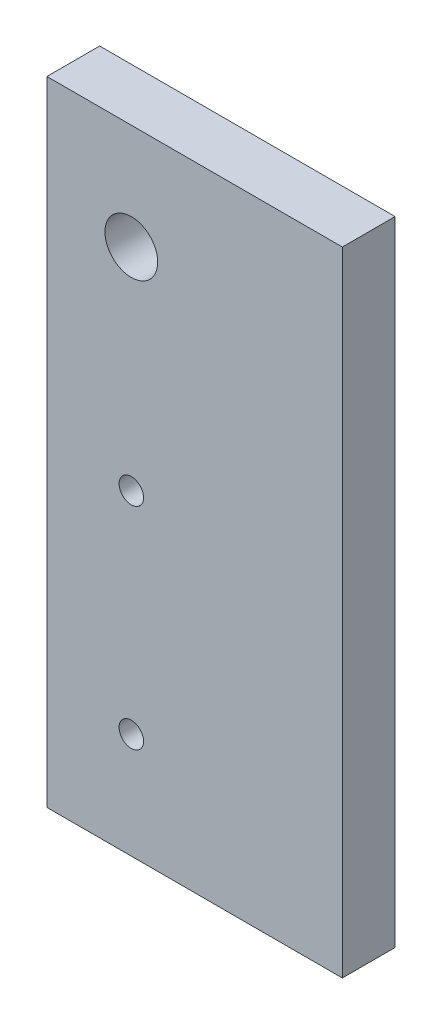
ISO-10303-21;
HEADER;
FILE_DESCRIPTION(('STEP AP214'),'2;1');
FILE_NAME('part.step','',(''),(''),'','','');
FILE_SCHEMA(('AUTOMOTIVE_DESIGN { 1 0 10303 214 1 1 1 1 }'));
ENDSEC;
DATA;
#1=APPLICATION_CONTEXT('core data for automotive mechanical design processes');
#2=APPLICATION_PROTOCOL_DEFINITION('international standard','automotive_design',2000,#1);
#3=PRODUCT_CONTEXT('',#1,'mechanical');
#4=PRODUCT('Part','Part','',(#3));
#5=PRODUCT_RELATED_PRODUCT_CATEGORY('part','',(#4));
#6=PRODUCT_DEFINITION_FORMATION('','',#4);
#7=PRODUCT_DEFINITION_CONTEXT('part definition',#1,'design');
#8=PRODUCT_DEFINITION('design','',#6,#7);
#9=PRODUCT_DEFINITION_SHAPE('','',#8);
#10=(LENGTH_UNIT() NAMED_UNIT(*) SI_UNIT(.MILLI.,.METRE.));
#11=(NAMED_UNIT(*) PLANE_ANGLE_UNIT() SI_UNIT($,.RADIAN.));
#12=(NAMED_UNIT(*) SI_UNIT($,.STERADIAN.) SOLID_ANGLE_UNIT());
#13=UNCERTAINTY_MEASURE_WITH_UNIT(LENGTH_MEASURE(1.E-05),#10,'distance_accuracy_value','');
#14=(GEOMETRIC_REPRESENTATION_CONTEXT(3) GLOBAL_UNCERTAINTY_ASSIGNED_CONTEXT((#13)) GLOBAL_UNIT_ASSIGNED_CONTEXT((#10,
#11,#12)) REPRESENTATION_CONTEXT('',''));
#15=CARTESIAN_POINT('',(0.,0.,0.));
#16=DIRECTION('',(0.,0.,1.));
#17=DIRECTION('',(1.,0.,0.));
#18=AXIS2_PLACEMENT_3D('',#15,#16,#17);
#19=CARTESIAN_POINT('',(0.,0.,6.35));
#20=DIRECTION('',(1.,0.,0.));
#21=DIRECTION('',(0.,0.,-1.));
#22=AXIS2_PLACEMENT_3D('',#19,#20,#21);
#23=PLANE('',#22);
#24=DIRECTION('',(0.,-1.,0.));
#25=VECTOR('',#24,1.);
#26=CARTESIAN_POINT('',(0.,0.,0.));
#27=LINE('',#26,#25);
#28=CARTESIAN_POINT('',(0.,76.2,0.));
#29=VERTEX_POINT('',#28);
#30=CARTESIAN_POINT('',(0.,0.,0.));
#31=VERTEX_POINT('',#30);
#32=EDGE_CURVE('E107',#29,#31,#27,.T.);
#33=ORIENTED_EDGE('',*,*,#32,.T.);
#34=DIRECTION('',(0.,0.,-1.));
#35=VECTOR('',#34,1.);
#36=CARTESIAN_POINT('',(0.,0.,6.35));
#37=LINE('',#36,#35);
#38=CARTESIAN_POINT('',(0.,0.,6.35));
#39=VERTEX_POINT('',#38);
#40=EDGE_CURVE('E11',#39,#31,#37,.T.);
#41=ORIENTED_EDGE('',*,*,#40,.F.);
#42=DIRECTION('',(0.,-1.,0.));
#43=VECTOR('',#42,1.);
#44=CARTESIAN_POINT('',(0.,0.,6.35));
#45=LINE('',#44,#43);
#46=CARTESIAN_POINT('',(0.,76.2,6.35));
#47=VERTEX_POINT('',#46);
#48=EDGE_CURVE('E91',#47,#39,#45,.T.);
#49=ORIENTED_EDGE('',*,*,#48,.F.);
#50=DIRECTION('',(0.,0.,-1.));
#51=VECTOR('',#50,1.);
#52=CARTESIAN_POINT('',(0.,76.2,6.35));
#53=LINE('',#52,#51);
#54=EDGE_CURVE('E103',#47,#29,#53,.T.);
#55=ORIENTED_EDGE('',*,*,#54,.T.);
#56=EDGE_LOOP('',(#33,#41,#49,#55));
#57=FACE_BOUND('',#56,.T.);
#58=ADVANCED_FACE('F39',(#57),#23,.F.);
#59=CARTESIAN_POINT('',(0.,0.,6.35));
#60=DIRECTION('',(0.,1.,0.));
#61=DIRECTION('',(0.,0.,1.));
#62=AXIS2_PLACEMENT_3D('',#59,#60,#61);
#63=PLANE('',#62);
#64=DIRECTION('',(1.,0.,0.));
#65=VECTOR('',#64,1.);
#66=CARTESIAN_POINT('',(0.,0.,0.));
#67=LINE('',#66,#65);
#68=CARTESIAN_POINT('',(35.56,0.,0.));
#69=VERTEX_POINT('',#68);
#70=EDGE_CURVE('E96',#31,#69,#67,.T.);
#71=ORIENTED_EDGE('',*,*,#70,.T.);
#72=DIRECTION('',(0.,0.,-1.));
#73=VECTOR('',#72,1.);
#74=CARTESIAN_POINT('',(35.56,0.,6.35));
#75=LINE('',#74,#73);
#76=CARTESIAN_POINT('',(35.56,0.,6.35));
#77=VERTEX_POINT('',#76);
#78=EDGE_CURVE('E48',#77,#69,#75,.T.);
#79=ORIENTED_EDGE('',*,*,#78,.F.);
#80=DIRECTION('',(1.,0.,0.));
#81=VECTOR('',#80,1.);
#82=CARTESIAN_POINT('',(0.,0.,6.35));
#83=LINE('',#82,#81);
#84=EDGE_CURVE('E86',#39,#77,#83,.T.);
#85=ORIENTED_EDGE('',*,*,#84,.F.);
#86=ORIENTED_EDGE('',*,*,#40,.T.);
#87=EDGE_LOOP('',(#71,#79,#85,#86));
#88=FACE_BOUND('',#87,.T.);
#89=ADVANCED_FACE('F95',(#88),#63,.F.);
#90=CARTESIAN_POINT('',(35.56,0.,6.35));
#91=DIRECTION('',(-1.,0.,0.));
#92=DIRECTION('',(0.,0.,1.));
#93=AXIS2_PLACEMENT_3D('',#90,#91,#92);
#94=PLANE('',#93);
#95=DIRECTION('',(0.,1.,0.));
#96=VECTOR('',#95,1.);
#97=CARTESIAN_POINT('',(35.56,0.,0.));
#98=LINE('',#97,#96);
#99=CARTESIAN_POINT('',(35.56,76.2,0.));
#100=VERTEX_POINT('',#99);
#101=EDGE_CURVE('E73',#69,#100,#98,.T.);
#102=ORIENTED_EDGE('',*,*,#101,.T.);
#103=DIRECTION('',(0.,0.,-1.));
#104=VECTOR('',#103,1.);
#105=CARTESIAN_POINT('',(35.56,76.2,6.35));
#106=LINE('',#105,#104);
#107=CARTESIAN_POINT('',(35.56,76.2,6.35));
#108=VERTEX_POINT('',#107);
#109=EDGE_CURVE('E98',#108,#100,#106,.T.);
#110=ORIENTED_EDGE('',*,*,#109,.F.);
#111=DIRECTION('',(0.,1.,0.));
#112=VECTOR('',#111,1.);
#113=CARTESIAN_POINT('',(35.56,0.,6.35));
#114=LINE('',#113,#112);
#115=EDGE_CURVE('E89',#77,#108,#114,.T.);
#116=ORIENTED_EDGE('',*,*,#115,.F.);
#117=ORIENTED_EDGE('',*,*,#78,.T.);
#118=EDGE_LOOP('',(#102,#110,#116,#117));
#119=FACE_BOUND('',#118,.T.);
#120=ADVANCED_FACE('F99',(#119),#94,.F.);
#121=CARTESIAN_POINT('',(0.,76.2,6.35));
#122=DIRECTION('',(0.,-1.,0.));
#123=DIRECTION('',(0.,0.,-1.));
#124=AXIS2_PLACEMENT_3D('',#121,#122,#123);
#125=PLANE('',#124);
#126=DIRECTION('',(-1.,0.,0.));
#127=VECTOR('',#126,1.);
#128=CARTESIAN_POINT('',(0.,76.2,0.));
#129=LINE('',#128,#127);
#130=EDGE_CURVE('E79',#100,#29,#129,.T.);
#131=ORIENTED_EDGE('',*,*,#130,.T.);
#132=ORIENTED_EDGE('',*,*,#54,.F.);
#133=DIRECTION('',(-1.,0.,0.));
#134=VECTOR('',#133,1.);
#135=CARTESIAN_POINT('',(0.,76.2,6.35));
#136=LINE('',#135,#134);
#137=EDGE_CURVE('E56',#108,#47,#136,.T.);
#138=ORIENTED_EDGE('',*,*,#137,.F.);
#139=ORIENTED_EDGE('',*,*,#109,.T.);
#140=EDGE_LOOP('',(#131,#132,#138,#139));
#141=FACE_BOUND('',#140,.T.);
#142=ADVANCED_FACE('F121',(#141),#125,.F.);
#143=CARTESIAN_POINT('',(0.,0.,6.35));
#144=DIRECTION('',(0.,0.,-1.));
#145=DIRECTION('',(-1.,0.,0.));
#146=AXIS2_PLACEMENT_3D('',#143,#144,#145);
#147=PLANE('',#146);
#148=CARTESIAN_POINT('',(10.16,63.5,6.35));
#149=DIRECTION('',(0.,0.,1.));
#150=DIRECTION('',(1.,0.,0.));
#151=AXIS2_PLACEMENT_3D('',#148,#149,#150);
#152=CIRCLE('',#151,3.175);
#153=CARTESIAN_POINT('',(13.335,63.5,6.35));
#154=VERTEX_POINT('',#153);
#155=EDGE_CURVE('E144',#154,#154,#152,.T.);
#156=ORIENTED_EDGE('',*,*,#155,.F.);
#157=EDGE_LOOP('',(#156));
#158=FACE_BOUND('',#157,.T.);
#159=CARTESIAN_POINT('',(10.16,38.1,6.35));
#160=DIRECTION('',(0.,0.,1.));
#161=DIRECTION('',(1.,0.,0.));
#162=AXIS2_PLACEMENT_3D('',#159,#160,#161);
#163=CIRCLE('',#162,1.4732);
#164=CARTESIAN_POINT('',(11.6332,38.1,6.35));
#165=VERTEX_POINT('',#164);
#166=EDGE_CURVE('E136',#165,#165,#163,.T.);
#167=ORIENTED_EDGE('',*,*,#166,.F.);
#168=EDGE_LOOP('',(#167));
#169=FACE_BOUND('',#168,.T.);
#170=CARTESIAN_POINT('',(10.16,12.7,6.35));
#171=DIRECTION('',(0.,0.,1.));
#172=DIRECTION('',(1.,0.,0.));
#173=AXIS2_PLACEMENT_3D('',#170,#171,#172);
#174=CIRCLE('',#173,1.4732);
#175=CARTESIAN_POINT('',(11.6332,12.7,6.35));
#176=VERTEX_POINT('',#175);
#177=EDGE_CURVE('E128',#176,#176,#174,.T.);
#178=ORIENTED_EDGE('',*,*,#177,.F.);
#179=EDGE_LOOP('',(#178));
#180=FACE_BOUND('',#179,.T.);
#181=ORIENTED_EDGE('',*,*,#48,.T.);
#182=ORIENTED_EDGE('',*,*,#84,.T.);
#183=ORIENTED_EDGE('',*,*,#115,.T.);
#184=ORIENTED_EDGE('',*,*,#137,.T.);
#185=EDGE_LOOP('',(#181,#182,#183,#184));
#186=FACE_BOUND('',#185,.T.);
#187=ADVANCED_FACE('F87',(#158,#169,#180,#186),#147,.F.);
#188=CARTESIAN_POINT('',(0.,0.,0.));
#189=DIRECTION('',(0.,0.,-1.));
#190=DIRECTION('',(-1.,0.,0.));
#191=AXIS2_PLACEMENT_3D('',#188,#189,#190);
#192=PLANE('',#191);
#193=CARTESIAN_POINT('',(10.16,63.5,0.));
#194=DIRECTION('',(0.,0.,1.));
#195=DIRECTION('',(1.,0.,0.));
#196=AXIS2_PLACEMENT_3D('',#193,#194,#195);
#197=CIRCLE('',#196,3.175);
#198=CARTESIAN_POINT('',(13.335,63.5,0.));
#199=VERTEX_POINT('',#198);
#200=EDGE_CURVE('E111',#199,#199,#197,.T.);
#201=ORIENTED_EDGE('',*,*,#200,.T.);
#202=EDGE_LOOP('',(#201));
#203=FACE_BOUND('',#202,.T.);
#204=CARTESIAN_POINT('',(10.16,38.1,0.));
#205=DIRECTION('',(0.,0.,1.));
#206=DIRECTION('',(1.,0.,0.));
#207=AXIS2_PLACEMENT_3D('',#204,#205,#206);
#208=CIRCLE('',#207,1.4732);
#209=CARTESIAN_POINT('',(11.6332,38.1,0.));
#210=VERTEX_POINT('',#209);
#211=EDGE_CURVE('E140',#210,#210,#208,.T.);
#212=ORIENTED_EDGE('',*,*,#211,.T.);
#213=EDGE_LOOP('',(#212));
#214=FACE_BOUND('',#213,.T.);
#215=CARTESIAN_POINT('',(10.16,12.7,0.));
#216=DIRECTION('',(0.,0.,1.));
#217=DIRECTION('',(1.,0.,0.));
#218=AXIS2_PLACEMENT_3D('',#215,#216,#217);
#219=CIRCLE('',#218,1.4732);
#220=CARTESIAN_POINT('',(11.6332,12.7,0.));
#221=VERTEX_POINT('',#220);
#222=EDGE_CURVE('E132',#221,#221,#219,.T.);
#223=ORIENTED_EDGE('',*,*,#222,.T.);
#224=EDGE_LOOP('',(#223));
#225=FACE_BOUND('',#224,.T.);
#226=ORIENTED_EDGE('',*,*,#32,.F.);
#227=ORIENTED_EDGE('',*,*,#130,.F.);
#228=ORIENTED_EDGE('',*,*,#101,.F.);
#229=ORIENTED_EDGE('',*,*,#70,.F.);
#230=EDGE_LOOP('',(#226,#227,#228,#229));
#231=FACE_BOUND('',#230,.T.);
#232=ADVANCED_FACE('F124',(#203,#214,#225,#231),#192,.T.);
#233=CARTESIAN_POINT('',(10.16,12.7,0.));
#234=DIRECTION('',(0.,0.,1.));
#235=DIRECTION('',(1.,0.,0.));
#236=AXIS2_PLACEMENT_3D('',#233,#234,#235);
#237=CYLINDRICAL_SURFACE('',#236,1.4732);
#238=ORIENTED_EDGE('',*,*,#222,.F.);
#239=EDGE_LOOP('',(#238));
#240=FACE_BOUND('',#239,.T.);
#241=ORIENTED_EDGE('',*,*,#177,.T.);
#242=EDGE_LOOP('',(#241));
#243=FACE_BOUND('',#242,.T.);
#244=ADVANCED_FACE('F168',(#240,#243),#237,.F.);
#245=CARTESIAN_POINT('',(10.16,38.1,0.));
#246=DIRECTION('',(0.,0.,1.));
#247=DIRECTION('',(1.,0.,0.));
#248=AXIS2_PLACEMENT_3D('',#245,#246,#247);
#249=CYLINDRICAL_SURFACE('',#248,1.4732);
#250=ORIENTED_EDGE('',*,*,#211,.F.);
#251=EDGE_LOOP('',(#250));
#252=FACE_BOUND('',#251,.T.);
#253=ORIENTED_EDGE('',*,*,#166,.T.);
#254=EDGE_LOOP('',(#253));
#255=FACE_BOUND('',#254,.T.);
#256=ADVANCED_FACE('F157',(#252,#255),#249,.F.);
#257=CARTESIAN_POINT('',(10.16,63.5,0.));
#258=DIRECTION('',(0.,0.,1.));
#259=DIRECTION('',(1.,0.,0.));
#260=AXIS2_PLACEMENT_3D('',#257,#258,#259);
#261=CYLINDRICAL_SURFACE('',#260,3.175);
#262=ORIENTED_EDGE('',*,*,#200,.F.);
#263=EDGE_LOOP('',(#262));
#264=FACE_BOUND('',#263,.T.);
#265=ORIENTED_EDGE('',*,*,#155,.T.);
#266=EDGE_LOOP('',(#265));
#267=FACE_BOUND('',#266,.T.);
#268=ADVANCED_FACE('F154',(#264,#267),#261,.F.);
#269=CLOSED_SHELL('',(#58,#89,#120,#142,#187,#232,#244,#256,#268));
#270=MANIFOLD_SOLID_BREP('B2',#269);
#271=ADVANCED_BREP_SHAPE_REPRESENTATION('',(#18,#270),#14);
#272=SHAPE_DEFINITION_REPRESENTATION(#9,#271);
ENDSEC;
END-ISO-10303-21;
